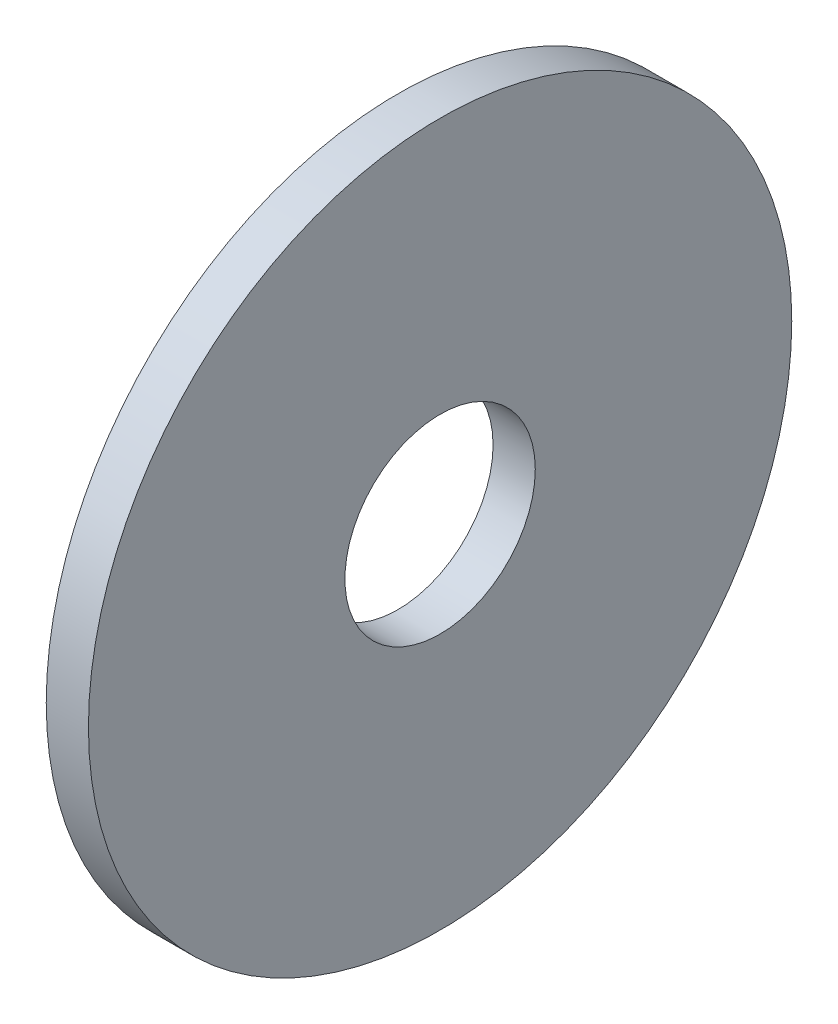
ISO-10303-21;
HEADER;
FILE_DESCRIPTION(('STEP AP214'),'2;1');
FILE_NAME('part.step','',(''),(''),'','','');
FILE_SCHEMA(('AUTOMOTIVE_DESIGN { 1 0 10303 214 1 1 1 1 }'));
ENDSEC;
DATA;
#1=APPLICATION_CONTEXT('core data for automotive mechanical design processes');
#2=APPLICATION_PROTOCOL_DEFINITION('international standard','automotive_design',2000,#1);
#3=PRODUCT_CONTEXT('',#1,'mechanical');
#4=PRODUCT('Part','Part','',(#3));
#5=PRODUCT_RELATED_PRODUCT_CATEGORY('part','',(#4));
#6=PRODUCT_DEFINITION_FORMATION('','',#4);
#7=PRODUCT_DEFINITION_CONTEXT('part definition',#1,'design');
#8=PRODUCT_DEFINITION('design','',#6,#7);
#9=PRODUCT_DEFINITION_SHAPE('','',#8);
#10=(LENGTH_UNIT() NAMED_UNIT(*) SI_UNIT(.MILLI.,.METRE.));
#11=(NAMED_UNIT(*) PLANE_ANGLE_UNIT() SI_UNIT($,.RADIAN.));
#12=(NAMED_UNIT(*) SI_UNIT($,.STERADIAN.) SOLID_ANGLE_UNIT());
#13=UNCERTAINTY_MEASURE_WITH_UNIT(LENGTH_MEASURE(1.E-05),#10,'distance_accuracy_value','');
#14=(GEOMETRIC_REPRESENTATION_CONTEXT(3) GLOBAL_UNCERTAINTY_ASSIGNED_CONTEXT((#13)) GLOBAL_UNIT_ASSIGNED_CONTEXT((#10,
#11,#12)) REPRESENTATION_CONTEXT('',''));
#15=CARTESIAN_POINT('',(0.,0.,0.));
#16=DIRECTION('',(0.,0.,1.));
#17=DIRECTION('',(1.,0.,0.));
#18=AXIS2_PLACEMENT_3D('',#15,#16,#17);
#19=CARTESIAN_POINT('',(1.143,0.,0.));
#20=DIRECTION('',(1.,0.,0.));
#21=DIRECTION('',(0.,0.,-1.));
#22=AXIS2_PLACEMENT_3D('',#19,#20,#21);
#23=PLANE('',#22);
#24=CARTESIAN_POINT('',(1.143,0.,0.));
#25=DIRECTION('',(1.,0.,0.));
#26=DIRECTION('',(0.,0.,-1.));
#27=AXIS2_PLACEMENT_3D('',#24,#25,#26);
#28=CIRCLE('',#27,9.525);
#29=CARTESIAN_POINT('',(1.143,0.,-9.525));
#30=VERTEX_POINT('',#29);
#31=EDGE_CURVE('E10',#30,#30,#28,.T.);
#32=ORIENTED_EDGE('',*,*,#31,.T.);
#33=EDGE_LOOP('',(#32));
#34=FACE_BOUND('',#33,.T.);
#35=CARTESIAN_POINT('',(1.143,0.,0.));
#36=DIRECTION('',(1.,0.,0.));
#37=DIRECTION('',(0.,0.,-1.));
#38=AXIS2_PLACEMENT_3D('',#35,#36,#37);
#39=CIRCLE('',#38,2.5781);
#40=CARTESIAN_POINT('',(1.143,0.,-2.5781));
#41=VERTEX_POINT('',#40);
#42=EDGE_CURVE('E42',#41,#41,#39,.T.);
#43=ORIENTED_EDGE('',*,*,#42,.F.);
#44=EDGE_LOOP('',(#43));
#45=FACE_BOUND('',#44,.T.);
#46=ADVANCED_FACE('F31',(#34,#45),#23,.T.);
#47=CARTESIAN_POINT('',(0.,0.,0.));
#48=DIRECTION('',(1.,0.,0.));
#49=DIRECTION('',(0.,0.,-1.));
#50=AXIS2_PLACEMENT_3D('',#47,#48,#49);
#51=PLANE('',#50);
#52=CARTESIAN_POINT('',(0.,0.,0.));
#53=DIRECTION('',(1.,0.,0.));
#54=DIRECTION('',(0.,0.,-1.));
#55=AXIS2_PLACEMENT_3D('',#52,#53,#54);
#56=CIRCLE('',#55,9.525);
#57=CARTESIAN_POINT('',(0.,0.,-9.525));
#58=VERTEX_POINT('',#57);
#59=EDGE_CURVE('E35',#58,#58,#56,.T.);
#60=ORIENTED_EDGE('',*,*,#59,.F.);
#61=EDGE_LOOP('',(#60));
#62=FACE_BOUND('',#61,.T.);
#63=CARTESIAN_POINT('',(0.,0.,0.));
#64=DIRECTION('',(1.,0.,0.));
#65=DIRECTION('',(0.,0.,-1.));
#66=AXIS2_PLACEMENT_3D('',#63,#64,#65);
#67=CIRCLE('',#66,2.5781);
#68=CARTESIAN_POINT('',(0.,0.,-2.5781));
#69=VERTEX_POINT('',#68);
#70=EDGE_CURVE('E44',#69,#69,#67,.T.);
#71=ORIENTED_EDGE('',*,*,#70,.T.);
#72=EDGE_LOOP('',(#71));
#73=FACE_BOUND('',#72,.T.);
#74=ADVANCED_FACE('F54',(#62,#73),#51,.F.);
#75=CARTESIAN_POINT('',(1.143,0.,0.));
#76=DIRECTION('',(-1.,0.,0.));
#77=DIRECTION('',(0.,0.,1.));
#78=AXIS2_PLACEMENT_3D('',#75,#76,#77);
#79=CYLINDRICAL_SURFACE('',#78,9.525);
#80=ORIENTED_EDGE('',*,*,#31,.F.);
#81=EDGE_LOOP('',(#80));
#82=FACE_BOUND('',#81,.T.);
#83=ORIENTED_EDGE('',*,*,#59,.T.);
#84=EDGE_LOOP('',(#83));
#85=FACE_BOUND('',#84,.T.);
#86=ADVANCED_FACE('F33',(#82,#85),#79,.T.);
#87=CARTESIAN_POINT('',(1.143,0.,0.));
#88=DIRECTION('',(-1.,0.,0.));
#89=DIRECTION('',(0.,0.,1.));
#90=AXIS2_PLACEMENT_3D('',#87,#88,#89);
#91=CYLINDRICAL_SURFACE('',#90,2.5781);
#92=ORIENTED_EDGE('',*,*,#42,.T.);
#93=EDGE_LOOP('',(#92));
#94=FACE_BOUND('',#93,.T.);
#95=ORIENTED_EDGE('',*,*,#70,.F.);
#96=EDGE_LOOP('',(#95));
#97=FACE_BOUND('',#96,.T.);
#98=ADVANCED_FACE('F50',(#94,#97),#91,.F.);
#99=CLOSED_SHELL('',(#46,#74,#86,#98));
#100=MANIFOLD_SOLID_BREP('B2',#99);
#101=ADVANCED_BREP_SHAPE_REPRESENTATION('',(#18,#100),#14);
#102=SHAPE_DEFINITION_REPRESENTATION(#9,#101);
ENDSEC;
END-ISO-10303-21;
